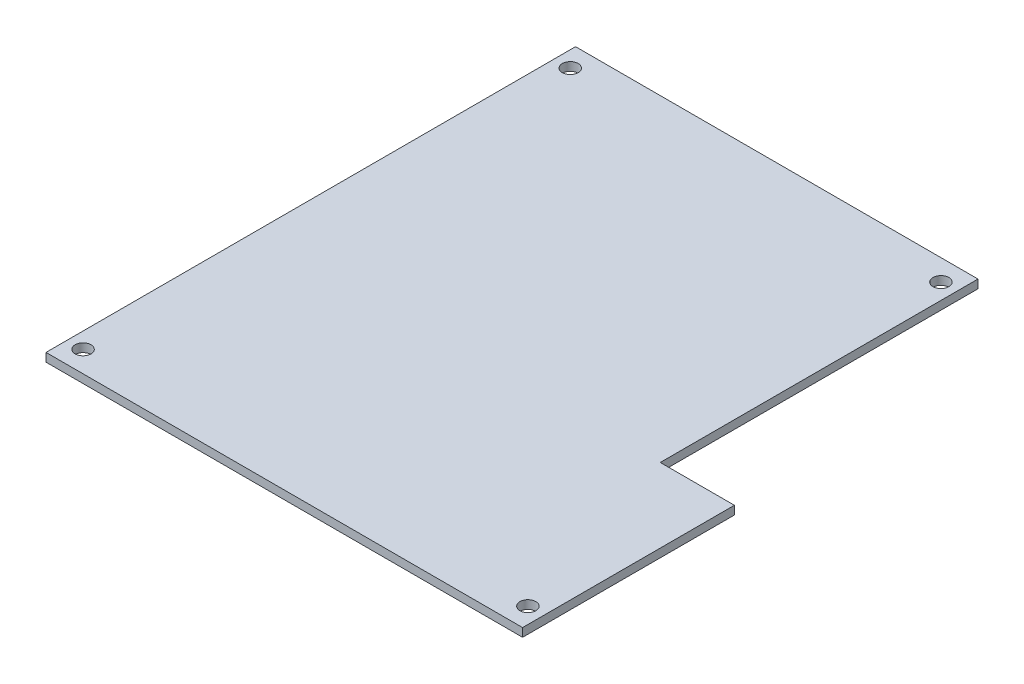
ISO-10303-21;
HEADER;
FILE_DESCRIPTION(('STEP AP214'),'2;1');
FILE_NAME('part.step','',(''),(''),'','','');
FILE_SCHEMA(('AUTOMOTIVE_DESIGN { 1 0 10303 214 1 1 1 1 }'));
ENDSEC;
DATA;
#1=APPLICATION_CONTEXT('core data for automotive mechanical design processes');
#2=APPLICATION_PROTOCOL_DEFINITION('international standard','automotive_design',2000,#1);
#3=PRODUCT_CONTEXT('',#1,'mechanical');
#4=PRODUCT('Part','Part','',(#3));
#5=PRODUCT_RELATED_PRODUCT_CATEGORY('part','',(#4));
#6=PRODUCT_DEFINITION_FORMATION('','',#4);
#7=PRODUCT_DEFINITION_CONTEXT('part definition',#1,'design');
#8=PRODUCT_DEFINITION('design','',#6,#7);
#9=PRODUCT_DEFINITION_SHAPE('','',#8);
#10=(LENGTH_UNIT() NAMED_UNIT(*) SI_UNIT(.MILLI.,.METRE.));
#11=(NAMED_UNIT(*) PLANE_ANGLE_UNIT() SI_UNIT($,.RADIAN.));
#12=(NAMED_UNIT(*) SI_UNIT($,.STERADIAN.) SOLID_ANGLE_UNIT());
#13=UNCERTAINTY_MEASURE_WITH_UNIT(LENGTH_MEASURE(1.E-05),#10,'distance_accuracy_value','');
#14=(GEOMETRIC_REPRESENTATION_CONTEXT(3) GLOBAL_UNCERTAINTY_ASSIGNED_CONTEXT((#13)) GLOBAL_UNIT_ASSIGNED_CONTEXT((#10,
#11,#12)) REPRESENTATION_CONTEXT('',''));
#15=CARTESIAN_POINT('',(0.,0.,0.));
#16=DIRECTION('',(0.,0.,1.));
#17=DIRECTION('',(1.,0.,0.));
#18=AXIS2_PLACEMENT_3D('',#15,#16,#17);
#19=CARTESIAN_POINT('',(0.,1.6,0.));
#20=DIRECTION('',(1.,0.,0.));
#21=DIRECTION('',(0.,0.,-1.));
#22=AXIS2_PLACEMENT_3D('',#19,#20,#21);
#23=PLANE('',#22);
#24=DIRECTION('',(0.,0.,1.));
#25=VECTOR('',#24,1.);
#26=CARTESIAN_POINT('',(0.,0.,0.));
#27=LINE('',#26,#25);
#28=CARTESIAN_POINT('',(0.,0.,-100.));
#29=VERTEX_POINT('',#28);
#30=CARTESIAN_POINT('',(0.,0.,0.));
#31=VERTEX_POINT('',#30);
#32=EDGE_CURVE('E128',#29,#31,#27,.T.);
#33=ORIENTED_EDGE('',*,*,#32,.T.);
#34=DIRECTION('',(0.,-1.,0.));
#35=VECTOR('',#34,1.);
#36=CARTESIAN_POINT('',(0.,1.6,0.));
#37=LINE('',#36,#35);
#38=CARTESIAN_POINT('',(0.,1.6,0.));
#39=VERTEX_POINT('',#38);
#40=EDGE_CURVE('E11',#39,#31,#37,.T.);
#41=ORIENTED_EDGE('',*,*,#40,.F.);
#42=DIRECTION('',(0.,0.,1.));
#43=VECTOR('',#42,1.);
#44=CARTESIAN_POINT('',(0.,1.6,0.));
#45=LINE('',#44,#43);
#46=CARTESIAN_POINT('',(0.,1.6,-100.));
#47=VERTEX_POINT('',#46);
#48=EDGE_CURVE('E138',#47,#39,#45,.T.);
#49=ORIENTED_EDGE('',*,*,#48,.F.);
#50=DIRECTION('',(0.,-1.,0.));
#51=VECTOR('',#50,1.);
#52=CARTESIAN_POINT('',(0.,1.6,-100.));
#53=LINE('',#52,#51);
#54=EDGE_CURVE('E124',#47,#29,#53,.T.);
#55=ORIENTED_EDGE('',*,*,#54,.T.);
#56=EDGE_LOOP('',(#33,#41,#49,#55));
#57=FACE_BOUND('',#56,.T.);
#58=ADVANCED_FACE('F42',(#57),#23,.F.);
#59=CARTESIAN_POINT('',(0.,1.6,0.));
#60=DIRECTION('',(0.,0.,-1.));
#61=DIRECTION('',(-1.,0.,0.));
#62=AXIS2_PLACEMENT_3D('',#59,#60,#61);
#63=PLANE('',#62);
#64=DIRECTION('',(1.,0.,0.));
#65=VECTOR('',#64,1.);
#66=CARTESIAN_POINT('',(0.,0.,0.));
#67=LINE('',#66,#65);
#68=CARTESIAN_POINT('',(90.,0.,0.));
#69=VERTEX_POINT('',#68);
#70=EDGE_CURVE('E131',#31,#69,#67,.T.);
#71=ORIENTED_EDGE('',*,*,#70,.T.);
#72=DIRECTION('',(0.,-1.,0.));
#73=VECTOR('',#72,1.);
#74=CARTESIAN_POINT('',(90.,1.6,0.));
#75=LINE('',#74,#73);
#76=CARTESIAN_POINT('',(90.,1.6,0.));
#77=VERTEX_POINT('',#76);
#78=EDGE_CURVE('E51',#77,#69,#75,.T.);
#79=ORIENTED_EDGE('',*,*,#78,.F.);
#80=DIRECTION('',(1.,0.,0.));
#81=VECTOR('',#80,1.);
#82=CARTESIAN_POINT('',(0.,1.6,0.));
#83=LINE('',#82,#81);
#84=EDGE_CURVE('E97',#39,#77,#83,.T.);
#85=ORIENTED_EDGE('',*,*,#84,.F.);
#86=ORIENTED_EDGE('',*,*,#40,.T.);
#87=EDGE_LOOP('',(#71,#79,#85,#86));
#88=FACE_BOUND('',#87,.T.);
#89=ADVANCED_FACE('F186',(#88),#63,.F.);
#90=CARTESIAN_POINT('',(90.,1.6,0.));
#91=DIRECTION('',(-1.,0.,0.));
#92=DIRECTION('',(0.,0.,1.));
#93=AXIS2_PLACEMENT_3D('',#90,#91,#92);
#94=PLANE('',#93);
#95=DIRECTION('',(0.,0.,-1.));
#96=VECTOR('',#95,1.);
#97=CARTESIAN_POINT('',(90.,0.,0.));
#98=LINE('',#97,#96);
#99=CARTESIAN_POINT('',(90.,0.,-40.));
#100=VERTEX_POINT('',#99);
#101=EDGE_CURVE('E133',#69,#100,#98,.T.);
#102=ORIENTED_EDGE('',*,*,#101,.T.);
#103=DIRECTION('',(0.,-1.,0.));
#104=VECTOR('',#103,1.);
#105=CARTESIAN_POINT('',(90.,1.6,-40.));
#106=LINE('',#105,#104);
#107=CARTESIAN_POINT('',(90.,1.6,-40.));
#108=VERTEX_POINT('',#107);
#109=EDGE_CURVE('E119',#108,#100,#106,.T.);
#110=ORIENTED_EDGE('',*,*,#109,.F.);
#111=DIRECTION('',(0.,0.,-1.));
#112=VECTOR('',#111,1.);
#113=CARTESIAN_POINT('',(90.,1.6,0.));
#114=LINE('',#113,#112);
#115=EDGE_CURVE('E110',#77,#108,#114,.T.);
#116=ORIENTED_EDGE('',*,*,#115,.F.);
#117=ORIENTED_EDGE('',*,*,#78,.T.);
#118=EDGE_LOOP('',(#102,#110,#116,#117));
#119=FACE_BOUND('',#118,.T.);
#120=ADVANCED_FACE('F190',(#119),#94,.F.);
#121=CARTESIAN_POINT('',(90.,1.6,-40.));
#122=DIRECTION('',(0.,0.,1.));
#123=DIRECTION('',(1.,0.,0.));
#124=AXIS2_PLACEMENT_3D('',#121,#122,#123);
#125=PLANE('',#124);
#126=DIRECTION('',(-1.,0.,0.));
#127=VECTOR('',#126,1.);
#128=CARTESIAN_POINT('',(90.,0.,-40.));
#129=LINE('',#128,#127);
#130=CARTESIAN_POINT('',(76.,0.,-40.));
#131=VERTEX_POINT('',#130);
#132=EDGE_CURVE('E118',#100,#131,#129,.T.);
#133=ORIENTED_EDGE('',*,*,#132,.T.);
#134=DIRECTION('',(0.,-1.,0.));
#135=VECTOR('',#134,1.);
#136=CARTESIAN_POINT('',(76.,1.6,-40.));
#137=LINE('',#136,#135);
#138=CARTESIAN_POINT('',(76.,1.6,-40.));
#139=VERTEX_POINT('',#138);
#140=EDGE_CURVE('E115',#139,#131,#137,.T.);
#141=ORIENTED_EDGE('',*,*,#140,.F.);
#142=DIRECTION('',(-1.,0.,0.));
#143=VECTOR('',#142,1.);
#144=CARTESIAN_POINT('',(90.,1.6,-40.));
#145=LINE('',#144,#143);
#146=EDGE_CURVE('E104',#108,#139,#145,.T.);
#147=ORIENTED_EDGE('',*,*,#146,.F.);
#148=ORIENTED_EDGE('',*,*,#109,.T.);
#149=EDGE_LOOP('',(#133,#141,#147,#148));
#150=FACE_BOUND('',#149,.T.);
#151=ADVANCED_FACE('F116',(#150),#125,.F.);
#152=CARTESIAN_POINT('',(76.,1.6,-40.));
#153=DIRECTION('',(-1.,0.,0.));
#154=DIRECTION('',(0.,0.,1.));
#155=AXIS2_PLACEMENT_3D('',#152,#153,#154);
#156=PLANE('',#155);
#157=DIRECTION('',(0.,0.,-1.));
#158=VECTOR('',#157,1.);
#159=CARTESIAN_POINT('',(76.,0.,-40.));
#160=LINE('',#159,#158);
#161=CARTESIAN_POINT('',(76.,0.,-100.));
#162=VERTEX_POINT('',#161);
#163=EDGE_CURVE('E83',#131,#162,#160,.T.);
#164=ORIENTED_EDGE('',*,*,#163,.T.);
#165=DIRECTION('',(0.,-1.,0.));
#166=VECTOR('',#165,1.);
#167=CARTESIAN_POINT('',(76.,1.6,-100.));
#168=LINE('',#167,#166);
#169=CARTESIAN_POINT('',(76.,1.6,-100.));
#170=VERTEX_POINT('',#169);
#171=EDGE_CURVE('E120',#170,#162,#168,.T.);
#172=ORIENTED_EDGE('',*,*,#171,.F.);
#173=DIRECTION('',(0.,0.,-1.));
#174=VECTOR('',#173,1.);
#175=CARTESIAN_POINT('',(76.,1.6,-40.));
#176=LINE('',#175,#174);
#177=EDGE_CURVE('E108',#139,#170,#176,.T.);
#178=ORIENTED_EDGE('',*,*,#177,.F.);
#179=ORIENTED_EDGE('',*,*,#140,.T.);
#180=EDGE_LOOP('',(#164,#172,#178,#179));
#181=FACE_BOUND('',#180,.T.);
#182=ADVANCED_FACE('F122',(#181),#156,.F.);
#183=CARTESIAN_POINT('',(0.,1.6,-100.));
#184=DIRECTION('',(0.,0.,1.));
#185=DIRECTION('',(1.,0.,0.));
#186=AXIS2_PLACEMENT_3D('',#183,#184,#185);
#187=PLANE('',#186);
#188=DIRECTION('',(-1.,0.,0.));
#189=VECTOR('',#188,1.);
#190=CARTESIAN_POINT('',(0.,0.,-100.));
#191=LINE('',#190,#189);
#192=EDGE_CURVE('E89',#162,#29,#191,.T.);
#193=ORIENTED_EDGE('',*,*,#192,.T.);
#194=ORIENTED_EDGE('',*,*,#54,.F.);
#195=DIRECTION('',(-1.,0.,0.));
#196=VECTOR('',#195,1.);
#197=CARTESIAN_POINT('',(0.,1.6,-100.));
#198=LINE('',#197,#196);
#199=EDGE_CURVE('E60',#170,#47,#198,.T.);
#200=ORIENTED_EDGE('',*,*,#199,.F.);
#201=ORIENTED_EDGE('',*,*,#171,.T.);
#202=EDGE_LOOP('',(#193,#194,#200,#201));
#203=FACE_BOUND('',#202,.T.);
#204=ADVANCED_FACE('F175',(#203),#187,.F.);
#205=CARTESIAN_POINT('',(0.,1.6,0.));
#206=DIRECTION('',(0.,-1.,0.));
#207=DIRECTION('',(0.,0.,-1.));
#208=AXIS2_PLACEMENT_3D('',#205,#206,#207);
#209=PLANE('',#208);
#210=CARTESIAN_POINT('',(87.,1.6,-4.));
#211=DIRECTION('',(0.,1.,0.));
#212=DIRECTION('',(0.,0.,1.));
#213=AXIS2_PLACEMENT_3D('',#210,#211,#212);
#214=CIRCLE('',#213,1.5);
#215=CARTESIAN_POINT('',(87.,1.6,-2.50000000000001));
#216=VERTEX_POINT('',#215);
#217=EDGE_CURVE('E269',#216,#216,#214,.T.);
#218=ORIENTED_EDGE('',*,*,#217,.F.);
#219=EDGE_LOOP('',(#218));
#220=FACE_BOUND('',#219,.T.);
#221=CARTESIAN_POINT('',(73.,1.6,-96.));
#222=DIRECTION('',(0.,1.,0.));
#223=DIRECTION('',(0.,0.,-1.));
#224=AXIS2_PLACEMENT_3D('',#221,#222,#223);
#225=CIRCLE('',#224,1.5);
#226=CARTESIAN_POINT('',(73.,1.6,-97.5));
#227=VERTEX_POINT('',#226);
#228=EDGE_CURVE('E266',#227,#227,#225,.T.);
#229=ORIENTED_EDGE('',*,*,#228,.F.);
#230=EDGE_LOOP('',(#229));
#231=FACE_BOUND('',#230,.T.);
#232=CARTESIAN_POINT('',(2.99999999999999,1.6,-4.));
#233=DIRECTION('',(0.,1.,0.));
#234=DIRECTION('',(0.,0.,-1.));
#235=AXIS2_PLACEMENT_3D('',#232,#233,#234);
#236=CIRCLE('',#235,1.5);
#237=CARTESIAN_POINT('',(2.99999999999999,1.6,-5.50000000000001));
#238=VERTEX_POINT('',#237);
#239=EDGE_CURVE('E268',#238,#238,#236,.T.);
#240=ORIENTED_EDGE('',*,*,#239,.F.);
#241=EDGE_LOOP('',(#240));
#242=FACE_BOUND('',#241,.T.);
#243=CARTESIAN_POINT('',(2.99999999999999,1.6,-96.));
#244=DIRECTION('',(0.,1.,0.));
#245=DIRECTION('',(0.,0.,1.));
#246=AXIS2_PLACEMENT_3D('',#243,#244,#245);
#247=CIRCLE('',#246,1.5);
#248=CARTESIAN_POINT('',(2.99999999999999,1.6,-94.5));
#249=VERTEX_POINT('',#248);
#250=EDGE_CURVE('E148',#249,#249,#247,.T.);
#251=ORIENTED_EDGE('',*,*,#250,.F.);
#252=EDGE_LOOP('',(#251));
#253=FACE_BOUND('',#252,.T.);
#254=ORIENTED_EDGE('',*,*,#48,.T.);
#255=ORIENTED_EDGE('',*,*,#84,.T.);
#256=ORIENTED_EDGE('',*,*,#115,.T.);
#257=ORIENTED_EDGE('',*,*,#146,.T.);
#258=ORIENTED_EDGE('',*,*,#177,.T.);
#259=ORIENTED_EDGE('',*,*,#199,.T.);
#260=EDGE_LOOP('',(#254,#255,#256,#257,#258,#259));
#261=FACE_BOUND('',#260,.T.);
#262=ADVANCED_FACE('F106',(#220,#231,#242,#253,#261),#209,.F.);
#263=CARTESIAN_POINT('',(0.,0.,0.));
#264=DIRECTION('',(0.,-1.,0.));
#265=DIRECTION('',(0.,0.,-1.));
#266=AXIS2_PLACEMENT_3D('',#263,#264,#265);
#267=PLANE('',#266);
#268=CARTESIAN_POINT('',(87.,0.,-4.));
#269=DIRECTION('',(0.,-1.,0.));
#270=DIRECTION('',(0.,0.,-1.));
#271=AXIS2_PLACEMENT_3D('',#268,#269,#270);
#272=CIRCLE('',#271,1.5);
#273=CARTESIAN_POINT('',(87.,0.,-5.5));
#274=VERTEX_POINT('',#273);
#275=EDGE_CURVE('E45',#274,#274,#272,.T.);
#276=ORIENTED_EDGE('',*,*,#275,.F.);
#277=EDGE_LOOP('',(#276));
#278=FACE_BOUND('',#277,.T.);
#279=CARTESIAN_POINT('',(73.,0.,-96.));
#280=DIRECTION('',(0.,-1.,0.));
#281=DIRECTION('',(0.,0.,-1.));
#282=AXIS2_PLACEMENT_3D('',#279,#280,#281);
#283=CIRCLE('',#282,1.5);
#284=CARTESIAN_POINT('',(73.,0.,-97.5));
#285=VERTEX_POINT('',#284);
#286=EDGE_CURVE('E150',#285,#285,#283,.T.);
#287=ORIENTED_EDGE('',*,*,#286,.F.);
#288=EDGE_LOOP('',(#287));
#289=FACE_BOUND('',#288,.T.);
#290=CARTESIAN_POINT('',(2.99999999999999,0.,-4.));
#291=DIRECTION('',(0.,-1.,0.));
#292=DIRECTION('',(0.,0.,-1.));
#293=AXIS2_PLACEMENT_3D('',#290,#291,#292);
#294=CIRCLE('',#293,1.5);
#295=CARTESIAN_POINT('',(2.99999999999999,0.,-5.50000000000001));
#296=VERTEX_POINT('',#295);
#297=EDGE_CURVE('E147',#296,#296,#294,.T.);
#298=ORIENTED_EDGE('',*,*,#297,.F.);
#299=EDGE_LOOP('',(#298));
#300=FACE_BOUND('',#299,.T.);
#301=CARTESIAN_POINT('',(2.99999999999999,0.,-96.));
#302=DIRECTION('',(0.,-1.,0.));
#303=DIRECTION('',(0.,0.,-1.));
#304=AXIS2_PLACEMENT_3D('',#301,#302,#303);
#305=CIRCLE('',#304,1.5);
#306=CARTESIAN_POINT('',(2.99999999999999,0.,-97.5));
#307=VERTEX_POINT('',#306);
#308=EDGE_CURVE('E144',#307,#307,#305,.T.);
#309=ORIENTED_EDGE('',*,*,#308,.F.);
#310=EDGE_LOOP('',(#309));
#311=FACE_BOUND('',#310,.T.);
#312=ORIENTED_EDGE('',*,*,#32,.F.);
#313=ORIENTED_EDGE('',*,*,#192,.F.);
#314=ORIENTED_EDGE('',*,*,#163,.F.);
#315=ORIENTED_EDGE('',*,*,#132,.F.);
#316=ORIENTED_EDGE('',*,*,#101,.F.);
#317=ORIENTED_EDGE('',*,*,#70,.F.);
#318=EDGE_LOOP('',(#312,#313,#314,#315,#316,#317));
#319=FACE_BOUND('',#318,.T.);
#320=ADVANCED_FACE('F160',(#278,#289,#300,#311,#319),#267,.T.);
#321=CARTESIAN_POINT('',(2.99999999999999,-8.4,-96.));
#322=DIRECTION('',(0.,1.,0.));
#323=DIRECTION('',(0.,0.,1.));
#324=AXIS2_PLACEMENT_3D('',#321,#322,#323);
#325=CYLINDRICAL_SURFACE('',#324,1.5);
#326=ORIENTED_EDGE('',*,*,#308,.T.);
#327=EDGE_LOOP('',(#326));
#328=FACE_BOUND('',#327,.T.);
#329=ORIENTED_EDGE('',*,*,#250,.T.);
#330=EDGE_LOOP('',(#329));
#331=FACE_BOUND('',#330,.T.);
#332=ADVANCED_FACE('F163',(#328,#331),#325,.F.);
#333=CARTESIAN_POINT('',(2.99999999999999,-8.4,-4.));
#334=DIRECTION('',(0.,1.,0.));
#335=DIRECTION('',(0.,0.,1.));
#336=AXIS2_PLACEMENT_3D('',#333,#334,#335);
#337=CYLINDRICAL_SURFACE('',#336,1.5);
#338=ORIENTED_EDGE('',*,*,#297,.T.);
#339=EDGE_LOOP('',(#338));
#340=FACE_BOUND('',#339,.T.);
#341=ORIENTED_EDGE('',*,*,#239,.T.);
#342=EDGE_LOOP('',(#341));
#343=FACE_BOUND('',#342,.T.);
#344=ADVANCED_FACE('F233',(#340,#343),#337,.F.);
#345=CARTESIAN_POINT('',(73.,-8.4,-96.));
#346=DIRECTION('',(0.,1.,0.));
#347=DIRECTION('',(0.,0.,1.));
#348=AXIS2_PLACEMENT_3D('',#345,#346,#347);
#349=CYLINDRICAL_SURFACE('',#348,1.5);
#350=ORIENTED_EDGE('',*,*,#286,.T.);
#351=EDGE_LOOP('',(#350));
#352=FACE_BOUND('',#351,.T.);
#353=ORIENTED_EDGE('',*,*,#228,.T.);
#354=EDGE_LOOP('',(#353));
#355=FACE_BOUND('',#354,.T.);
#356=ADVANCED_FACE('F243',(#352,#355),#349,.F.);
#357=CARTESIAN_POINT('',(87.,-8.4,-4.));
#358=DIRECTION('',(0.,1.,0.));
#359=DIRECTION('',(0.,0.,1.));
#360=AXIS2_PLACEMENT_3D('',#357,#358,#359);
#361=CYLINDRICAL_SURFACE('',#360,1.5);
#362=ORIENTED_EDGE('',*,*,#275,.T.);
#363=EDGE_LOOP('',(#362));
#364=FACE_BOUND('',#363,.T.);
#365=ORIENTED_EDGE('',*,*,#217,.T.);
#366=EDGE_LOOP('',(#365));
#367=FACE_BOUND('',#366,.T.);
#368=ADVANCED_FACE('F157',(#364,#367),#361,.F.);
#369=CLOSED_SHELL('',(#58,#89,#120,#151,#182,#204,#262,#320,#332,#344,#356,#368));
#370=MANIFOLD_SOLID_BREP('B2',#369);
#371=ADVANCED_BREP_SHAPE_REPRESENTATION('',(#18,#370),#14);
#372=SHAPE_DEFINITION_REPRESENTATION(#9,#371);
ENDSEC;
END-ISO-10303-21;
